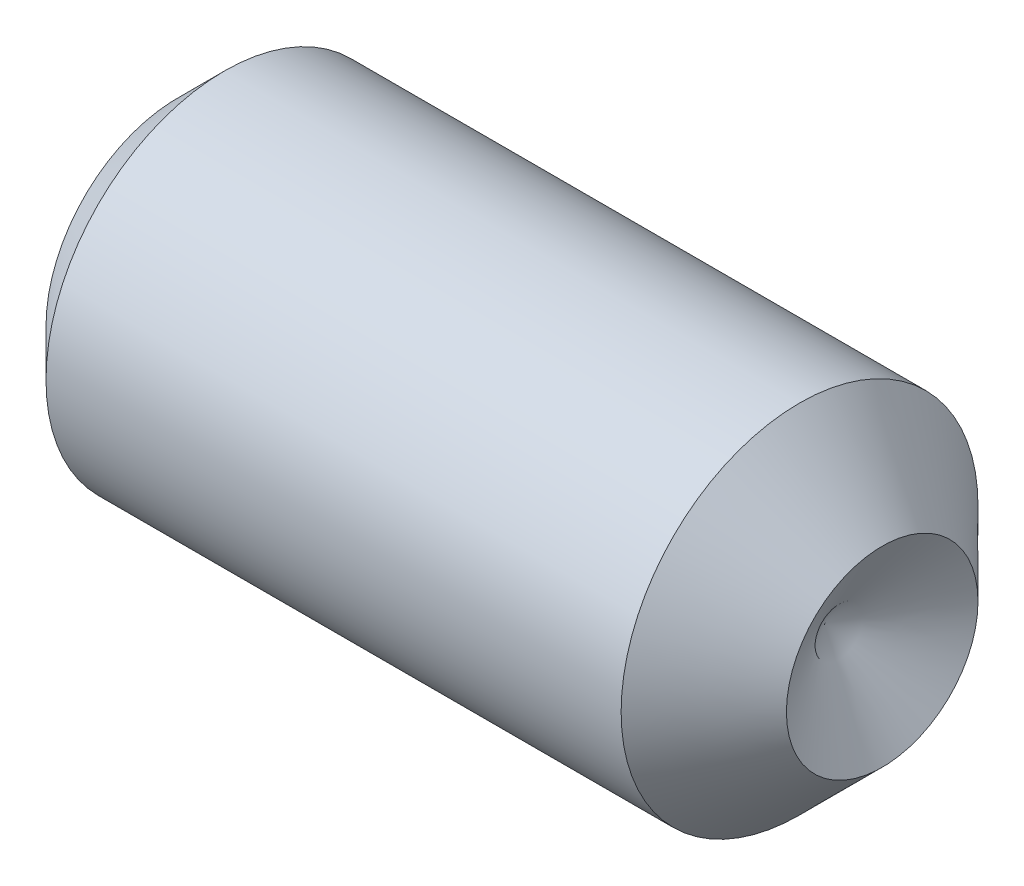
ISO-10303-21;
HEADER;
FILE_DESCRIPTION(('STEP AP214'),'2;1');
FILE_NAME('part.step','',(''),(''),'','','');
FILE_SCHEMA(('AUTOMOTIVE_DESIGN { 1 0 10303 214 1 1 1 1 }'));
ENDSEC;
DATA;
#1=APPLICATION_CONTEXT('core data for automotive mechanical design processes');
#2=APPLICATION_PROTOCOL_DEFINITION('international standard','automotive_design',2000,#1);
#3=PRODUCT_CONTEXT('',#1,'mechanical');
#4=PRODUCT('Part','Part','',(#3));
#5=PRODUCT_RELATED_PRODUCT_CATEGORY('part','',(#4));
#6=PRODUCT_DEFINITION_FORMATION('','',#4);
#7=PRODUCT_DEFINITION_CONTEXT('part definition',#1,'design');
#8=PRODUCT_DEFINITION('design','',#6,#7);
#9=PRODUCT_DEFINITION_SHAPE('','',#8);
#10=(LENGTH_UNIT() NAMED_UNIT(*) SI_UNIT(.MILLI.,.METRE.));
#11=(NAMED_UNIT(*) PLANE_ANGLE_UNIT() SI_UNIT($,.RADIAN.));
#12=(NAMED_UNIT(*) SI_UNIT($,.STERADIAN.) SOLID_ANGLE_UNIT());
#13=UNCERTAINTY_MEASURE_WITH_UNIT(LENGTH_MEASURE(1.E-05),#10,'distance_accuracy_value','');
#14=(GEOMETRIC_REPRESENTATION_CONTEXT(3) GLOBAL_UNCERTAINTY_ASSIGNED_CONTEXT((#13)) GLOBAL_UNIT_ASSIGNED_CONTEXT((#10,
#11,#12)) REPRESENTATION_CONTEXT('',''));
#15=CARTESIAN_POINT('',(0.,0.,0.));
#16=DIRECTION('',(0.,0.,1.));
#17=DIRECTION('',(1.,0.,0.));
#18=AXIS2_PLACEMENT_3D('',#15,#16,#17);
#19=CARTESIAN_POINT('',(0.,0.,0.));
#20=DIRECTION('',(-1.,0.,0.));
#21=DIRECTION('',(0.,0.,1.));
#22=AXIS2_PLACEMENT_3D('',#19,#20,#21);
#23=PLANE('',#22);
#24=CARTESIAN_POINT('',(0.,0.,0.));
#25=DIRECTION('',(-1.,0.,0.));
#26=DIRECTION('',(0.,0.,1.));
#27=AXIS2_PLACEMENT_3D('',#24,#25,#26);
#28=CIRCLE('',#27,1.78308);
#29=CARTESIAN_POINT('',(0.,0.,1.78308));
#30=VERTEX_POINT('',#29);
#31=EDGE_CURVE('E11',#30,#30,#28,.T.);
#32=ORIENTED_EDGE('',*,*,#31,.T.);
#33=EDGE_LOOP('',(#32));
#34=FACE_BOUND('',#33,.T.);
#35=DIRECTION('',(0.,0.,-1.));
#36=VECTOR('',#35,1.);
#37=CARTESIAN_POINT('',(0.,1.18999,0.687041046832963));
#38=LINE('',#37,#36);
#39=CARTESIAN_POINT('',(0.,1.18999,0.687041046832963));
#40=VERTEX_POINT('',#39);
#41=CARTESIAN_POINT('',(0.,1.18999,-0.687041046832962));
#42=VERTEX_POINT('',#41);
#43=EDGE_CURVE('E94',#40,#42,#38,.T.);
#44=ORIENTED_EDGE('',*,*,#43,.F.);
#45=DIRECTION('',(0.,-0.866025403784438,0.5));
#46=VECTOR('',#45,1.);
#47=CARTESIAN_POINT('',(0.,1.18999,0.687041046832963));
#48=LINE('',#47,#46);
#49=CARTESIAN_POINT('',(0.,0.,1.37408209366593));
#50=VERTEX_POINT('',#49);
#51=EDGE_CURVE('E47',#40,#50,#48,.T.);
#52=ORIENTED_EDGE('',*,*,#51,.T.);
#53=DIRECTION('',(0.,0.866025403784439,0.5));
#54=VECTOR('',#53,1.);
#55=CARTESIAN_POINT('',(0.,-1.18999,0.687041046832963));
#56=LINE('',#55,#54);
#57=CARTESIAN_POINT('',(0.,-1.18999,0.687041046832963));
#58=VERTEX_POINT('',#57);
#59=EDGE_CURVE('E100',#58,#50,#56,.T.);
#60=ORIENTED_EDGE('',*,*,#59,.F.);
#61=DIRECTION('',(0.,0.,-1.));
#62=VECTOR('',#61,1.);
#63=CARTESIAN_POINT('',(0.,-1.18999,0.687041046832963));
#64=LINE('',#63,#62);
#65=CARTESIAN_POINT('',(0.,-1.18999,-0.687041046832962));
#66=VERTEX_POINT('',#65);
#67=EDGE_CURVE('E120',#58,#66,#64,.T.);
#68=ORIENTED_EDGE('',*,*,#67,.T.);
#69=DIRECTION('',(0.,0.866025403784438,-0.5));
#70=VECTOR('',#69,1.);
#71=CARTESIAN_POINT('',(0.,-1.18999,-0.687041046832962));
#72=LINE('',#71,#70);
#73=CARTESIAN_POINT('',(0.,0.,-1.37408209366593));
#74=VERTEX_POINT('',#73);
#75=EDGE_CURVE('E123',#66,#74,#72,.T.);
#76=ORIENTED_EDGE('',*,*,#75,.T.);
#77=DIRECTION('',(0.,-0.866025403784438,-0.5));
#78=VECTOR('',#77,1.);
#79=CARTESIAN_POINT('',(0.,1.18999,-0.687041046832962));
#80=LINE('',#79,#78);
#81=EDGE_CURVE('E126',#42,#74,#80,.T.);
#82=ORIENTED_EDGE('',*,*,#81,.F.);
#83=EDGE_LOOP('',(#44,#52,#60,#68,#76,#82));
#84=FACE_BOUND('',#83,.T.);
#85=ADVANCED_FACE('F33',(#34,#84),#23,.T.);
#86=CARTESIAN_POINT('',(0.,0.,0.));
#87=DIRECTION('',(1.,0.,0.));
#88=DIRECTION('',(0.,0.,-1.));
#89=AXIS2_PLACEMENT_3D('',#86,#87,#88);
#90=CONICAL_SURFACE('',#89,1.78308,0.78539816339745);
#91=CARTESIAN_POINT('',(0.629919999999999,0.,0.));
#92=DIRECTION('',(-1.,0.,0.));
#93=DIRECTION('',(0.,0.,1.));
#94=AXIS2_PLACEMENT_3D('',#91,#92,#93);
#95=CIRCLE('',#94,2.413);
#96=CARTESIAN_POINT('',(0.629919999999999,0.,2.413));
#97=VERTEX_POINT('',#96);
#98=EDGE_CURVE('E40',#97,#97,#95,.T.);
#99=ORIENTED_EDGE('',*,*,#98,.T.);
#100=EDGE_LOOP('',(#99));
#101=FACE_BOUND('',#100,.T.);
#102=ORIENTED_EDGE('',*,*,#31,.F.);
#103=EDGE_LOOP('',(#102));
#104=FACE_BOUND('',#103,.T.);
#105=ADVANCED_FACE('F146',(#101,#104),#90,.T.);
#106=CARTESIAN_POINT('',(-12.7,0.,0.));
#107=DIRECTION('',(-1.,0.,0.));
#108=DIRECTION('',(0.,0.,1.));
#109=AXIS2_PLACEMENT_3D('',#106,#107,#108);
#110=CYLINDRICAL_SURFACE('',#109,2.413);
#111=CARTESIAN_POINT('',(8.40740000000003,0.,0.));
#112=DIRECTION('',(-1.,0.,0.));
#113=DIRECTION('',(0.,0.,1.));
#114=AXIS2_PLACEMENT_3D('',#111,#112,#113);
#115=CIRCLE('',#114,2.413);
#116=CARTESIAN_POINT('',(8.40740000000003,0.,2.413));
#117=VERTEX_POINT('',#116);
#118=EDGE_CURVE('E141',#117,#117,#115,.T.);
#119=ORIENTED_EDGE('',*,*,#118,.T.);
#120=EDGE_LOOP('',(#119));
#121=FACE_BOUND('',#120,.T.);
#122=ORIENTED_EDGE('',*,*,#98,.F.);
#123=EDGE_LOOP('',(#122));
#124=FACE_BOUND('',#123,.T.);
#125=ADVANCED_FACE('F149',(#121,#124),#110,.T.);
#126=CARTESIAN_POINT('',(8.40740000000003,0.,0.));
#127=DIRECTION('',(-1.,0.,0.));
#128=DIRECTION('',(0.,0.,1.));
#129=AXIS2_PLACEMENT_3D('',#126,#127,#128);
#130=CONICAL_SURFACE('',#129,2.413,0.785398163397462);
#131=CARTESIAN_POINT('',(9.525,0.,0.));
#132=DIRECTION('',(-1.,0.,0.));
#133=DIRECTION('',(0.,0.,1.));
#134=AXIS2_PLACEMENT_3D('',#131,#132,#133);
#135=CIRCLE('',#134,1.2954);
#136=CARTESIAN_POINT('',(9.525,0.,1.2954));
#137=VERTEX_POINT('',#136);
#138=EDGE_CURVE('E101',#137,#137,#135,.T.);
#139=ORIENTED_EDGE('',*,*,#138,.T.);
#140=EDGE_LOOP('',(#139));
#141=FACE_BOUND('',#140,.T.);
#142=ORIENTED_EDGE('',*,*,#118,.F.);
#143=EDGE_LOOP('',(#142));
#144=FACE_BOUND('',#143,.T.);
#145=ADVANCED_FACE('F151',(#141,#144),#130,.T.);
#146=CARTESIAN_POINT('',(8.7466451541117,0.,0.));
#147=DIRECTION('',(1.,0.,0.));
#148=DIRECTION('',(0.,0.,-1.));
#149=AXIS2_PLACEMENT_3D('',#146,#147,#148);
#150=CONICAL_SURFACE('',#149,0.,1.02974425867666);
#151=ORIENTED_EDGE('',*,*,#138,.F.);
#152=EDGE_LOOP('',(#151));
#153=FACE_BOUND('',#152,.T.);
#154=CARTESIAN_POINT('',(8.7466451541117,0.,0.));
#155=VERTEX_POINT('',#154);
#156=VERTEX_LOOP('',#155);
#157=FACE_BOUND('',#156,.T.);
#158=ADVANCED_FACE('F158',(#153,#157),#150,.F.);
#159=CARTESIAN_POINT('',(2.54,1.18999,0.687041046832963));
#160=DIRECTION('',(0.,-0.5,-0.866025403784439));
#161=DIRECTION('',(0.,0.866025403784438,-0.5));
#162=AXIS2_PLACEMENT_3D('',#159,#160,#161);
#163=PLANE('',#162);
#164=ORIENTED_EDGE('',*,*,#51,.F.);
#165=DIRECTION('',(-1.,0.,0.));
#166=VECTOR('',#165,1.);
#167=CARTESIAN_POINT('',(2.54,1.18999,0.687041046832963));
#168=LINE('',#167,#166);
#169=CARTESIAN_POINT('',(2.54,1.18999,0.687041046832963));
#170=VERTEX_POINT('',#169);
#171=EDGE_CURVE('E88',#170,#40,#168,.T.);
#172=ORIENTED_EDGE('',*,*,#171,.F.);
#173=DIRECTION('',(0.,-0.866025403784438,0.5));
#174=VECTOR('',#173,1.);
#175=CARTESIAN_POINT('',(2.54,1.18999,0.687041046832963));
#176=LINE('',#175,#174);
#177=CARTESIAN_POINT('',(2.54,0.,1.37408209366593));
#178=VERTEX_POINT('',#177);
#179=EDGE_CURVE('E83',#170,#178,#176,.T.);
#180=ORIENTED_EDGE('',*,*,#179,.T.);
#181=DIRECTION('',(-1.,0.,0.));
#182=VECTOR('',#181,1.);
#183=CARTESIAN_POINT('',(2.54,0.,1.37408209366593));
#184=LINE('',#183,#182);
#185=EDGE_CURVE('E86',#178,#50,#184,.T.);
#186=ORIENTED_EDGE('',*,*,#185,.T.);
#187=EDGE_LOOP('',(#164,#172,#180,#186));
#188=FACE_BOUND('',#187,.T.);
#189=ADVANCED_FACE('F85',(#188),#163,.T.);
#190=CARTESIAN_POINT('',(2.54,-1.18999,0.687041046832963));
#191=DIRECTION('',(0.,-0.5,0.866025403784439));
#192=DIRECTION('',(0.,-0.866025403784439,-0.5));
#193=AXIS2_PLACEMENT_3D('',#190,#191,#192);
#194=PLANE('',#193);
#195=ORIENTED_EDGE('',*,*,#59,.T.);
#196=ORIENTED_EDGE('',*,*,#185,.F.);
#197=DIRECTION('',(0.,0.866025403784439,0.5));
#198=VECTOR('',#197,1.);
#199=CARTESIAN_POINT('',(2.54,-1.18999,0.687041046832963));
#200=LINE('',#199,#198);
#201=CARTESIAN_POINT('',(2.54,-1.18999,0.687041046832963));
#202=VERTEX_POINT('',#201);
#203=EDGE_CURVE('E93',#202,#178,#200,.T.);
#204=ORIENTED_EDGE('',*,*,#203,.F.);
#205=DIRECTION('',(-1.,0.,0.));
#206=VECTOR('',#205,1.);
#207=CARTESIAN_POINT('',(2.54,-1.18999,0.687041046832963));
#208=LINE('',#207,#206);
#209=EDGE_CURVE('E102',#202,#58,#208,.T.);
#210=ORIENTED_EDGE('',*,*,#209,.T.);
#211=EDGE_LOOP('',(#195,#196,#204,#210));
#212=FACE_BOUND('',#211,.T.);
#213=ADVANCED_FACE('F98',(#212),#194,.F.);
#214=CARTESIAN_POINT('',(2.54,-1.18999,0.687041046832963));
#215=DIRECTION('',(0.,1.,0.));
#216=DIRECTION('',(0.,0.,1.));
#217=AXIS2_PLACEMENT_3D('',#214,#215,#216);
#218=PLANE('',#217);
#219=ORIENTED_EDGE('',*,*,#67,.F.);
#220=ORIENTED_EDGE('',*,*,#209,.F.);
#221=DIRECTION('',(0.,0.,-1.));
#222=VECTOR('',#221,1.);
#223=CARTESIAN_POINT('',(2.54,-1.18999,0.687041046832963));
#224=LINE('',#223,#222);
#225=CARTESIAN_POINT('',(2.54,-1.18999,-0.687041046832962));
#226=VERTEX_POINT('',#225);
#227=EDGE_CURVE('E107',#202,#226,#224,.T.);
#228=ORIENTED_EDGE('',*,*,#227,.T.);
#229=DIRECTION('',(-1.,0.,0.));
#230=VECTOR('',#229,1.);
#231=CARTESIAN_POINT('',(2.54,-1.18999,-0.687041046832962));
#232=LINE('',#231,#230);
#233=EDGE_CURVE('E136',#226,#66,#232,.T.);
#234=ORIENTED_EDGE('',*,*,#233,.T.);
#235=EDGE_LOOP('',(#219,#220,#228,#234));
#236=FACE_BOUND('',#235,.T.);
#237=ADVANCED_FACE('F181',(#236),#218,.T.);
#238=CARTESIAN_POINT('',(2.54,-1.18999,-0.687041046832962));
#239=DIRECTION('',(0.,0.5,0.866025403784439));
#240=DIRECTION('',(0.,-0.866025403784438,0.5));
#241=AXIS2_PLACEMENT_3D('',#238,#239,#240);
#242=PLANE('',#241);
#243=ORIENTED_EDGE('',*,*,#75,.F.);
#244=ORIENTED_EDGE('',*,*,#233,.F.);
#245=DIRECTION('',(0.,0.866025403784438,-0.5));
#246=VECTOR('',#245,1.);
#247=CARTESIAN_POINT('',(2.54,-1.18999,-0.687041046832962));
#248=LINE('',#247,#246);
#249=CARTESIAN_POINT('',(2.54,0.,-1.37408209366593));
#250=VERTEX_POINT('',#249);
#251=EDGE_CURVE('E109',#226,#250,#248,.T.);
#252=ORIENTED_EDGE('',*,*,#251,.T.);
#253=DIRECTION('',(-1.,0.,0.));
#254=VECTOR('',#253,1.);
#255=CARTESIAN_POINT('',(2.54,0.,-1.37408209366593));
#256=LINE('',#255,#254);
#257=EDGE_CURVE('E134',#250,#74,#256,.T.);
#258=ORIENTED_EDGE('',*,*,#257,.T.);
#259=EDGE_LOOP('',(#243,#244,#252,#258));
#260=FACE_BOUND('',#259,.T.);
#261=ADVANCED_FACE('F177',(#260),#242,.T.);
#262=CARTESIAN_POINT('',(2.54,1.18999,-0.687041046832962));
#263=DIRECTION('',(0.,0.5,-0.866025403784438));
#264=DIRECTION('',(0.,0.866025403784438,0.5));
#265=AXIS2_PLACEMENT_3D('',#262,#263,#264);
#266=PLANE('',#265);
#267=ORIENTED_EDGE('',*,*,#81,.T.);
#268=ORIENTED_EDGE('',*,*,#257,.F.);
#269=DIRECTION('',(0.,-0.866025403784438,-0.5));
#270=VECTOR('',#269,1.);
#271=CARTESIAN_POINT('',(2.54,1.18999,-0.687041046832962));
#272=LINE('',#271,#270);
#273=CARTESIAN_POINT('',(2.54,1.18999,-0.687041046832962));
#274=VERTEX_POINT('',#273);
#275=EDGE_CURVE('E113',#274,#250,#272,.T.);
#276=ORIENTED_EDGE('',*,*,#275,.F.);
#277=DIRECTION('',(-1.,0.,0.));
#278=VECTOR('',#277,1.);
#279=CARTESIAN_POINT('',(2.54,1.18999,-0.687041046832962));
#280=LINE('',#279,#278);
#281=EDGE_CURVE('E132',#274,#42,#280,.T.);
#282=ORIENTED_EDGE('',*,*,#281,.T.);
#283=EDGE_LOOP('',(#267,#268,#276,#282));
#284=FACE_BOUND('',#283,.T.);
#285=ADVANCED_FACE('F174',(#284),#266,.F.);
#286=CARTESIAN_POINT('',(2.54,1.18999,0.687041046832963));
#287=DIRECTION('',(0.,1.,0.));
#288=DIRECTION('',(0.,0.,1.));
#289=AXIS2_PLACEMENT_3D('',#286,#287,#288);
#290=PLANE('',#289);
#291=ORIENTED_EDGE('',*,*,#43,.T.);
#292=ORIENTED_EDGE('',*,*,#281,.F.);
#293=DIRECTION('',(0.,0.,-1.));
#294=VECTOR('',#293,1.);
#295=CARTESIAN_POINT('',(2.54,1.18999,0.687041046832963));
#296=LINE('',#295,#294);
#297=EDGE_CURVE('E116',#170,#274,#296,.T.);
#298=ORIENTED_EDGE('',*,*,#297,.F.);
#299=ORIENTED_EDGE('',*,*,#171,.T.);
#300=EDGE_LOOP('',(#291,#292,#298,#299));
#301=FACE_BOUND('',#300,.T.);
#302=ADVANCED_FACE('F170',(#301),#290,.F.);
#303=CARTESIAN_POINT('',(2.54,2.37998,0.));
#304=DIRECTION('',(1.,0.,0.));
#305=DIRECTION('',(0.,0.,-1.));
#306=AXIS2_PLACEMENT_3D('',#303,#304,#305);
#307=PLANE('',#306);
#308=ORIENTED_EDGE('',*,*,#179,.F.);
#309=ORIENTED_EDGE('',*,*,#297,.T.);
#310=ORIENTED_EDGE('',*,*,#275,.T.);
#311=ORIENTED_EDGE('',*,*,#251,.F.);
#312=ORIENTED_EDGE('',*,*,#227,.F.);
#313=ORIENTED_EDGE('',*,*,#203,.T.);
#314=EDGE_LOOP('',(#308,#309,#310,#311,#312,#313));
#315=FACE_BOUND('',#314,.T.);
#316=ADVANCED_FACE('F105',(#315),#307,.F.);
#317=CLOSED_SHELL('',(#85,#105,#125,#145,#158,#189,#213,#237,#261,#285,#302,#316));
#318=MANIFOLD_SOLID_BREP('B2',#317);
#319=ADVANCED_BREP_SHAPE_REPRESENTATION('',(#18,#318),#14);
#320=SHAPE_DEFINITION_REPRESENTATION(#9,#319);
ENDSEC;
END-ISO-10303-21;
